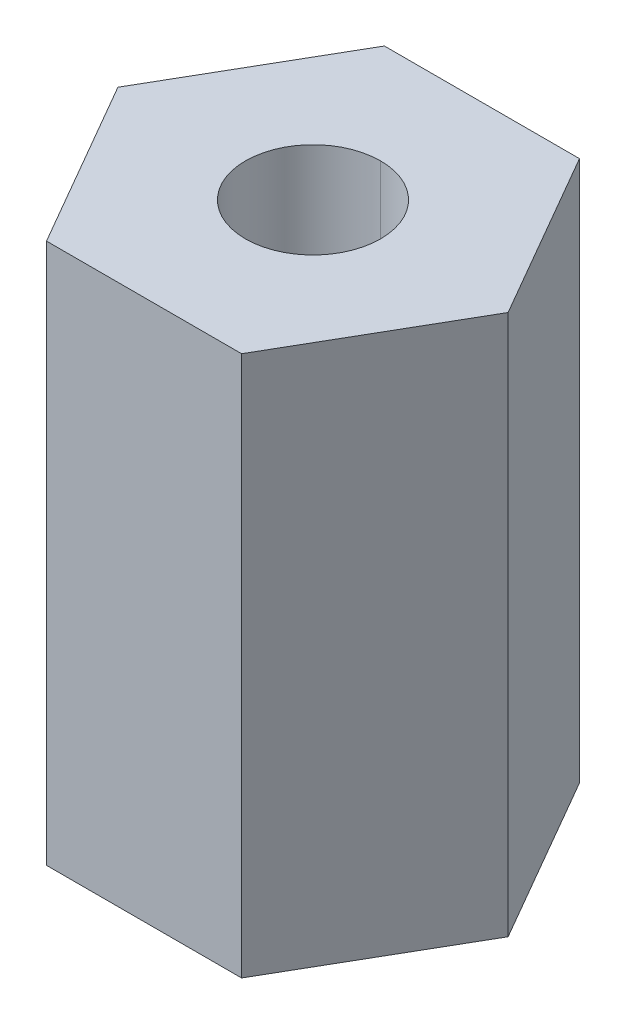
ISO-10303-21;
HEADER;
FILE_DESCRIPTION(('STEP AP214'),'2;1');
FILE_NAME('part.step','',(''),(''),'','','');
FILE_SCHEMA(('AUTOMOTIVE_DESIGN { 1 0 10303 214 1 1 1 1 }'));
ENDSEC;
DATA;
#1=APPLICATION_CONTEXT('core data for automotive mechanical design processes');
#2=APPLICATION_PROTOCOL_DEFINITION('international standard','automotive_design',2000,#1);
#3=PRODUCT_CONTEXT('',#1,'mechanical');
#4=PRODUCT('Part','Part','',(#3));
#5=PRODUCT_RELATED_PRODUCT_CATEGORY('part','',(#4));
#6=PRODUCT_DEFINITION_FORMATION('','',#4);
#7=PRODUCT_DEFINITION_CONTEXT('part definition',#1,'design');
#8=PRODUCT_DEFINITION('design','',#6,#7);
#9=PRODUCT_DEFINITION_SHAPE('','',#8);
#10=(LENGTH_UNIT() NAMED_UNIT(*) SI_UNIT(.MILLI.,.METRE.));
#11=(NAMED_UNIT(*) PLANE_ANGLE_UNIT() SI_UNIT($,.RADIAN.));
#12=(NAMED_UNIT(*) SI_UNIT($,.STERADIAN.) SOLID_ANGLE_UNIT());
#13=UNCERTAINTY_MEASURE_WITH_UNIT(LENGTH_MEASURE(1.E-05),#10,'distance_accuracy_value','');
#14=(GEOMETRIC_REPRESENTATION_CONTEXT(3) GLOBAL_UNCERTAINTY_ASSIGNED_CONTEXT((#13)) GLOBAL_UNIT_ASSIGNED_CONTEXT((#10,
#11,#12)) REPRESENTATION_CONTEXT('',''));
#15=CARTESIAN_POINT('',(0.,0.,0.));
#16=DIRECTION('',(0.,0.,1.));
#17=DIRECTION('',(1.,0.,0.));
#18=AXIS2_PLACEMENT_3D('',#15,#16,#17);
#19=CARTESIAN_POINT('',(0.,8.00000000000001,0.));
#20=DIRECTION('',(0.,-1.,0.));
#21=DIRECTION('',(1.,0.,0.));
#22=AXIS2_PLACEMENT_3D('',#19,#20,#21);
#23=CYLINDRICAL_SURFACE('',#22,1.);
#24=DIRECTION('',(0.,-1.,0.));
#25=VECTOR('',#24,1.);
#26=CARTESIAN_POINT('',(0.,4.,-1.));
#27=LINE('',#26,#25);
#28=CARTESIAN_POINT('',(0.,8.,-1.));
#29=VERTEX_POINT('',#28);
#30=CARTESIAN_POINT('',(0.,0.,-1.));
#31=VERTEX_POINT('',#30);
#32=EDGE_CURVE('E119',#29,#31,#27,.T.);
#33=ORIENTED_EDGE('',*,*,#32,.F.);
#34=CARTESIAN_POINT('',(0.,8.00000000000001,0.));
#35=DIRECTION('',(0.,-1.,0.));
#36=DIRECTION('',(0.,0.,1.));
#37=AXIS2_PLACEMENT_3D('',#34,#35,#36);
#38=CIRCLE('',#37,1.);
#39=CARTESIAN_POINT('',(0.,8.,1.));
#40=VERTEX_POINT('',#39);
#41=EDGE_CURVE('E114',#40,#29,#38,.T.);
#42=ORIENTED_EDGE('',*,*,#41,.F.);
#43=DIRECTION('',(0.,-1.,0.));
#44=VECTOR('',#43,1.);
#45=CARTESIAN_POINT('',(0.,4.,1.));
#46=LINE('',#45,#44);
#47=CARTESIAN_POINT('',(0.,0.,1.));
#48=VERTEX_POINT('',#47);
#49=EDGE_CURVE('E116',#40,#48,#46,.T.);
#50=ORIENTED_EDGE('',*,*,#49,.T.);
#51=CARTESIAN_POINT('',(0.,0.,0.));
#52=DIRECTION('',(0.,-1.,0.));
#53=DIRECTION('',(0.,0.,1.));
#54=AXIS2_PLACEMENT_3D('',#51,#52,#53);
#55=CIRCLE('',#54,1.);
#56=EDGE_CURVE('E166',#48,#31,#55,.T.);
#57=ORIENTED_EDGE('',*,*,#56,.T.);
#58=EDGE_LOOP('',(#33,#42,#50,#57));
#59=FACE_BOUND('',#58,.T.);
#60=ADVANCED_FACE('F16',(#59),#23,.F.);
#61=CARTESIAN_POINT('',(1.43837567300093,-0.01,2.50866025403838));
#62=DIRECTION('',(0.866025403838329,0.,0.49999999990666));
#63=DIRECTION('',(0.49999999990666,0.,-0.866025403838329));
#64=AXIS2_PLACEMENT_3D('',#61,#62,#63);
#65=PLANE('',#64);
#66=DIRECTION('',(0.500000000006738,0.,-0.866025403780548));
#67=VECTOR('',#66,1.);
#68=CARTESIAN_POINT('',(2.1650635095,0.,1.25));
#69=LINE('',#68,#67);
#70=CARTESIAN_POINT('',(1.443375673,0.,2.5));
#71=VERTEX_POINT('',#70);
#72=CARTESIAN_POINT('',(2.886751346,0.,0.));
#73=VERTEX_POINT('',#72);
#74=EDGE_CURVE('E131',#71,#73,#69,.T.);
#75=ORIENTED_EDGE('',*,*,#74,.T.);
#76=DIRECTION('',(0.,-1.,0.));
#77=VECTOR('',#76,1.);
#78=CARTESIAN_POINT('',(2.886751346,4.,0.));
#79=LINE('',#78,#77);
#80=CARTESIAN_POINT('',(2.886751346,8.,0.));
#81=VERTEX_POINT('',#80);
#82=EDGE_CURVE('E11',#81,#73,#79,.T.);
#83=ORIENTED_EDGE('',*,*,#82,.F.);
#84=DIRECTION('',(0.500000000006738,0.,-0.866025403780548));
#85=VECTOR('',#84,1.);
#86=CARTESIAN_POINT('',(2.1650635095,8.,1.25));
#87=LINE('',#86,#85);
#88=CARTESIAN_POINT('',(1.443375673,8.,2.5));
#89=VERTEX_POINT('',#88);
#90=EDGE_CURVE('E169',#89,#81,#87,.T.);
#91=ORIENTED_EDGE('',*,*,#90,.F.);
#92=DIRECTION('',(0.,-1.,0.));
#93=VECTOR('',#92,1.);
#94=CARTESIAN_POINT('',(1.443375673,4.,2.5));
#95=LINE('',#94,#93);
#96=EDGE_CURVE('E124',#89,#71,#95,.T.);
#97=ORIENTED_EDGE('',*,*,#96,.T.);
#98=EDGE_LOOP('',(#75,#83,#91,#97));
#99=FACE_BOUND('',#98,.T.);
#100=ADVANCED_FACE('F216',(#99),#65,.T.);
#101=CARTESIAN_POINT('',(2.89175134599907,-0.01,0.00866025403838329));
#102=DIRECTION('',(0.866025403838329,0.,-0.49999999990666));
#103=DIRECTION('',(-0.49999999990666,0.,-0.866025403838329));
#104=AXIS2_PLACEMENT_3D('',#101,#102,#103);
#105=PLANE('',#104);
#106=DIRECTION('',(-0.500000000006738,0.,-0.866025403780548));
#107=VECTOR('',#106,1.);
#108=CARTESIAN_POINT('',(2.1650635095,0.,-1.25));
#109=LINE('',#108,#107);
#110=CARTESIAN_POINT('',(1.443375673,0.,-2.5));
#111=VERTEX_POINT('',#110);
#112=EDGE_CURVE('E163',#73,#111,#109,.T.);
#113=ORIENTED_EDGE('',*,*,#112,.T.);
#114=DIRECTION('',(0.,-1.,0.));
#115=VECTOR('',#114,1.);
#116=CARTESIAN_POINT('',(1.443375673,4.,-2.5));
#117=LINE('',#116,#115);
#118=CARTESIAN_POINT('',(1.443375673,8.,-2.5));
#119=VERTEX_POINT('',#118);
#120=EDGE_CURVE('E27',#119,#111,#117,.T.);
#121=ORIENTED_EDGE('',*,*,#120,.F.);
#122=DIRECTION('',(-0.500000000006738,0.,-0.866025403780548));
#123=VECTOR('',#122,1.);
#124=CARTESIAN_POINT('',(2.1650635095,8.,-1.25));
#125=LINE('',#124,#123);
#126=EDGE_CURVE('E172',#81,#119,#125,.T.);
#127=ORIENTED_EDGE('',*,*,#126,.F.);
#128=ORIENTED_EDGE('',*,*,#82,.T.);
#129=EDGE_LOOP('',(#113,#121,#127,#128));
#130=FACE_BOUND('',#129,.T.);
#131=ADVANCED_FACE('F206',(#130),#105,.T.);
#132=CARTESIAN_POINT('',(1.453375673,-0.01,-2.5));
#133=DIRECTION('',(0.,0.,-1.));
#134=DIRECTION('',(-1.,0.,0.));
#135=AXIS2_PLACEMENT_3D('',#132,#133,#134);
#136=PLANE('',#135);
#137=DIRECTION('',(-1.,0.,0.));
#138=VECTOR('',#137,1.);
#139=CARTESIAN_POINT('',(0.,0.,-2.5));
#140=LINE('',#139,#138);
#141=CARTESIAN_POINT('',(-1.443375673,0.,-2.5));
#142=VERTEX_POINT('',#141);
#143=EDGE_CURVE('E160',#111,#142,#140,.T.);
#144=ORIENTED_EDGE('',*,*,#143,.T.);
#145=DIRECTION('',(0.,-1.,0.));
#146=VECTOR('',#145,1.);
#147=CARTESIAN_POINT('',(-1.443375673,4.,-2.5));
#148=LINE('',#147,#146);
#149=CARTESIAN_POINT('',(-1.443375673,8.,-2.5));
#150=VERTEX_POINT('',#149);
#151=EDGE_CURVE('E72',#150,#142,#148,.T.);
#152=ORIENTED_EDGE('',*,*,#151,.F.);
#153=DIRECTION('',(-1.,0.,0.));
#154=VECTOR('',#153,1.);
#155=CARTESIAN_POINT('',(0.,8.,-2.5));
#156=LINE('',#155,#154);
#157=EDGE_CURVE('E176',#119,#150,#156,.T.);
#158=ORIENTED_EDGE('',*,*,#157,.F.);
#159=ORIENTED_EDGE('',*,*,#120,.T.);
#160=EDGE_LOOP('',(#144,#152,#158,#159));
#161=FACE_BOUND('',#160,.T.);
#162=ADVANCED_FACE('F202',(#161),#136,.T.);
#163=CARTESIAN_POINT('',(-1.43837567300093,-0.01,-2.50866025403838));
#164=DIRECTION('',(-0.866025403838329,0.,-0.49999999990666));
#165=DIRECTION('',(-0.49999999990666,0.,0.866025403838329));
#166=AXIS2_PLACEMENT_3D('',#163,#164,#165);
#167=PLANE('',#166);
#168=DIRECTION('',(-0.500000000006738,0.,0.866025403780548));
#169=VECTOR('',#168,1.);
#170=CARTESIAN_POINT('',(-2.1650635095,0.,-1.25));
#171=LINE('',#170,#169);
#172=CARTESIAN_POINT('',(-2.886751346,0.,0.));
#173=VERTEX_POINT('',#172);
#174=EDGE_CURVE('E156',#142,#173,#171,.T.);
#175=ORIENTED_EDGE('',*,*,#174,.T.);
#176=DIRECTION('',(0.,-1.,0.));
#177=VECTOR('',#176,1.);
#178=CARTESIAN_POINT('',(-2.886751346,4.,0.));
#179=LINE('',#178,#177);
#180=CARTESIAN_POINT('',(-2.886751346,8.,0.));
#181=VERTEX_POINT('',#180);
#182=EDGE_CURVE('E194',#181,#173,#179,.T.);
#183=ORIENTED_EDGE('',*,*,#182,.F.);
#184=DIRECTION('',(-0.500000000006738,0.,0.866025403780548));
#185=VECTOR('',#184,1.);
#186=CARTESIAN_POINT('',(-2.1650635095,8.,-1.25));
#187=LINE('',#186,#185);
#188=EDGE_CURVE('E179',#150,#181,#187,.T.);
#189=ORIENTED_EDGE('',*,*,#188,.F.);
#190=ORIENTED_EDGE('',*,*,#151,.T.);
#191=EDGE_LOOP('',(#175,#183,#189,#190));
#192=FACE_BOUND('',#191,.T.);
#193=ADVANCED_FACE('F213',(#192),#167,.T.);
#194=CARTESIAN_POINT('',(-2.89175134599907,-0.01,-0.00866025403838329));
#195=DIRECTION('',(-0.866025403838329,0.,0.49999999990666));
#196=DIRECTION('',(0.49999999990666,0.,0.866025403838329));
#197=AXIS2_PLACEMENT_3D('',#194,#195,#196);
#198=PLANE('',#197);
#199=DIRECTION('',(0.500000000006738,0.,0.866025403780548));
#200=VECTOR('',#199,1.);
#201=CARTESIAN_POINT('',(-2.1650635095,0.,1.25));
#202=LINE('',#201,#200);
#203=CARTESIAN_POINT('',(-1.443375673,0.,2.5));
#204=VERTEX_POINT('',#203);
#205=EDGE_CURVE('E153',#173,#204,#202,.T.);
#206=ORIENTED_EDGE('',*,*,#205,.T.);
#207=DIRECTION('',(0.,-1.,0.));
#208=VECTOR('',#207,1.);
#209=CARTESIAN_POINT('',(-1.443375673,4.,2.5));
#210=LINE('',#209,#208);
#211=CARTESIAN_POINT('',(-1.443375673,8.,2.5));
#212=VERTEX_POINT('',#211);
#213=EDGE_CURVE('E42',#212,#204,#210,.T.);
#214=ORIENTED_EDGE('',*,*,#213,.F.);
#215=DIRECTION('',(0.500000000006738,0.,0.866025403780548));
#216=VECTOR('',#215,1.);
#217=CARTESIAN_POINT('',(-2.1650635095,8.,1.25));
#218=LINE('',#217,#216);
#219=EDGE_CURVE('E183',#181,#212,#218,.T.);
#220=ORIENTED_EDGE('',*,*,#219,.F.);
#221=ORIENTED_EDGE('',*,*,#182,.T.);
#222=EDGE_LOOP('',(#206,#214,#220,#221));
#223=FACE_BOUND('',#222,.T.);
#224=ADVANCED_FACE('F219',(#223),#198,.T.);
#225=CARTESIAN_POINT('',(-1.453375673,-0.01,2.5));
#226=DIRECTION('',(0.,0.,1.));
#227=DIRECTION('',(1.,0.,0.));
#228=AXIS2_PLACEMENT_3D('',#225,#226,#227);
#229=PLANE('',#228);
#230=DIRECTION('',(1.,0.,0.));
#231=VECTOR('',#230,1.);
#232=CARTESIAN_POINT('',(0.,0.,2.5));
#233=LINE('',#232,#231);
#234=EDGE_CURVE('E149',#204,#71,#233,.T.);
#235=ORIENTED_EDGE('',*,*,#234,.T.);
#236=ORIENTED_EDGE('',*,*,#96,.F.);
#237=DIRECTION('',(1.,0.,0.));
#238=VECTOR('',#237,1.);
#239=CARTESIAN_POINT('',(0.,8.,2.5));
#240=LINE('',#239,#238);
#241=EDGE_CURVE('E125',#212,#89,#240,.T.);
#242=ORIENTED_EDGE('',*,*,#241,.F.);
#243=ORIENTED_EDGE('',*,*,#213,.T.);
#244=EDGE_LOOP('',(#235,#236,#242,#243));
#245=FACE_BOUND('',#244,.T.);
#246=ADVANCED_FACE('F218',(#245),#229,.T.);
#247=CARTESIAN_POINT('',(-2.896751346,8.,-2.51));
#248=DIRECTION('',(0.,1.,0.));
#249=DIRECTION('',(0.,0.,1.));
#250=AXIS2_PLACEMENT_3D('',#247,#248,#249);
#251=PLANE('',#250);
#252=CARTESIAN_POINT('',(0.,8.00000000000001,0.));
#253=DIRECTION('',(0.,-1.,0.));
#254=DIRECTION('',(0.,0.,-1.));
#255=AXIS2_PLACEMENT_3D('',#252,#253,#254);
#256=CIRCLE('',#255,1.);
#257=EDGE_CURVE('E20',#29,#40,#256,.T.);
#258=ORIENTED_EDGE('',*,*,#257,.T.);
#259=ORIENTED_EDGE('',*,*,#41,.T.);
#260=EDGE_LOOP('',(#258,#259));
#261=FACE_BOUND('',#260,.T.);
#262=ORIENTED_EDGE('',*,*,#90,.T.);
#263=ORIENTED_EDGE('',*,*,#126,.T.);
#264=ORIENTED_EDGE('',*,*,#157,.T.);
#265=ORIENTED_EDGE('',*,*,#188,.T.);
#266=ORIENTED_EDGE('',*,*,#219,.T.);
#267=ORIENTED_EDGE('',*,*,#241,.T.);
#268=EDGE_LOOP('',(#262,#263,#264,#265,#266,#267));
#269=FACE_BOUND('',#268,.T.);
#270=ADVANCED_FACE('F133',(#261,#269),#251,.T.);
#271=CARTESIAN_POINT('',(-2.896751346,0.,2.51));
#272=DIRECTION('',(0.,-1.,0.));
#273=DIRECTION('',(0.,0.,-1.));
#274=AXIS2_PLACEMENT_3D('',#271,#272,#273);
#275=PLANE('',#274);
#276=CARTESIAN_POINT('',(0.,0.,0.));
#277=DIRECTION('',(0.,-1.,0.));
#278=DIRECTION('',(0.,0.,-1.));
#279=AXIS2_PLACEMENT_3D('',#276,#277,#278);
#280=CIRCLE('',#279,1.);
#281=EDGE_CURVE('E129',#31,#48,#280,.T.);
#282=ORIENTED_EDGE('',*,*,#281,.F.);
#283=ORIENTED_EDGE('',*,*,#56,.F.);
#284=EDGE_LOOP('',(#282,#283));
#285=FACE_BOUND('',#284,.T.);
#286=ORIENTED_EDGE('',*,*,#74,.F.);
#287=ORIENTED_EDGE('',*,*,#234,.F.);
#288=ORIENTED_EDGE('',*,*,#205,.F.);
#289=ORIENTED_EDGE('',*,*,#174,.F.);
#290=ORIENTED_EDGE('',*,*,#143,.F.);
#291=ORIENTED_EDGE('',*,*,#112,.F.);
#292=EDGE_LOOP('',(#286,#287,#288,#289,#290,#291));
#293=FACE_BOUND('',#292,.T.);
#294=ADVANCED_FACE('F209',(#285,#293),#275,.T.);
#295=CARTESIAN_POINT('',(0.,8.00000000000001,0.));
#296=DIRECTION('',(0.,-1.,0.));
#297=DIRECTION('',(0.,0.,-1.));
#298=AXIS2_PLACEMENT_3D('',#295,#296,#297);
#299=CYLINDRICAL_SURFACE('',#298,1.);
#300=ORIENTED_EDGE('',*,*,#257,.F.);
#301=ORIENTED_EDGE('',*,*,#32,.T.);
#302=ORIENTED_EDGE('',*,*,#281,.T.);
#303=ORIENTED_EDGE('',*,*,#49,.F.);
#304=EDGE_LOOP('',(#300,#301,#302,#303));
#305=FACE_BOUND('',#304,.T.);
#306=ADVANCED_FACE('F18',(#305),#299,.F.);
#307=CLOSED_SHELL('',(#60,#100,#131,#162,#193,#224,#246,#270,#294,#306));
#308=MANIFOLD_SOLID_BREP('B1',#307);
#309=ADVANCED_BREP_SHAPE_REPRESENTATION('',(#18,#308),#14);
#310=SHAPE_DEFINITION_REPRESENTATION(#9,#309);
ENDSEC;
END-ISO-10303-21;
